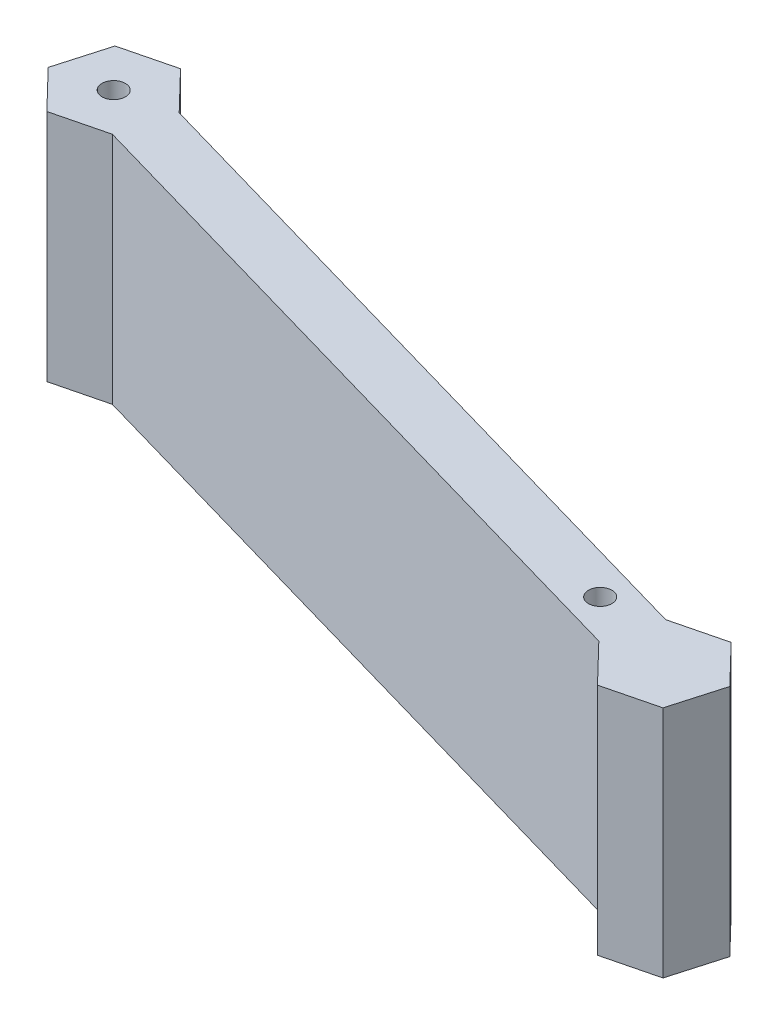
ISO-10303-21;
HEADER;
FILE_DESCRIPTION(('STEP AP214'),'2;1');
FILE_NAME('part.step','',(''),(''),'','','');
FILE_SCHEMA(('AUTOMOTIVE_DESIGN { 1 0 10303 214 1 1 1 1 }'));
ENDSEC;
DATA;
#1=APPLICATION_CONTEXT('core data for automotive mechanical design processes');
#2=APPLICATION_PROTOCOL_DEFINITION('international standard','automotive_design',2000,#1);
#3=PRODUCT_CONTEXT('',#1,'mechanical');
#4=PRODUCT('Part','Part','',(#3));
#5=PRODUCT_RELATED_PRODUCT_CATEGORY('part','',(#4));
#6=PRODUCT_DEFINITION_FORMATION('','',#4);
#7=PRODUCT_DEFINITION_CONTEXT('part definition',#1,'design');
#8=PRODUCT_DEFINITION('design','',#6,#7);
#9=PRODUCT_DEFINITION_SHAPE('','',#8);
#10=(LENGTH_UNIT() NAMED_UNIT(*) SI_UNIT(.MILLI.,.METRE.));
#11=(NAMED_UNIT(*) PLANE_ANGLE_UNIT() SI_UNIT($,.RADIAN.));
#12=(NAMED_UNIT(*) SI_UNIT($,.STERADIAN.) SOLID_ANGLE_UNIT());
#13=UNCERTAINTY_MEASURE_WITH_UNIT(LENGTH_MEASURE(1.E-05),#10,'distance_accuracy_value','');
#14=(GEOMETRIC_REPRESENTATION_CONTEXT(3) GLOBAL_UNCERTAINTY_ASSIGNED_CONTEXT((#13)) GLOBAL_UNIT_ASSIGNED_CONTEXT((#10,
#11,#12)) REPRESENTATION_CONTEXT('',''));
#15=CARTESIAN_POINT('',(0.,0.,0.));
#16=DIRECTION('',(0.,0.,1.));
#17=DIRECTION('',(1.,0.,0.));
#18=AXIS2_PLACEMENT_3D('',#15,#16,#17);
#19=CARTESIAN_POINT('',(-1.91026278693189,30.,6.65964684385465));
#20=DIRECTION('',(-0.241835763884429,0.,-0.970317197264088));
#21=DIRECTION('',(-0.970317197264088,0.,0.241835763884429));
#22=AXIS2_PLACEMENT_3D('',#19,#20,#21);
#23=PLANE('',#22);
#24=DIRECTION('',(0.970317197264088,0.,-0.241835763884429));
#25=VECTOR('',#24,1.);
#26=CARTESIAN_POINT('',(-1.91026278693189,0.,6.65964684385465));
#27=LINE('',#26,#25);
#28=CARTESIAN_POINT('',(-1.91026278693189,0.,6.65964684385465));
#29=VERTEX_POINT('',#28);
#30=CARTESIAN_POINT('',(4.81229195354504,0.,4.9841595233144));
#31=VERTEX_POINT('',#30);
#32=EDGE_CURVE('E120',#29,#31,#27,.T.);
#33=ORIENTED_EDGE('',*,*,#32,.T.);
#34=DIRECTION('',(0.,-1.,0.));
#35=VECTOR('',#34,1.);
#36=CARTESIAN_POINT('',(4.81229195354504,30.,4.9841595233144));
#37=LINE('',#36,#35);
#38=CARTESIAN_POINT('',(4.81229195354504,30.,4.9841595233144));
#39=VERTEX_POINT('',#38);
#40=EDGE_CURVE('E11',#39,#31,#37,.T.);
#41=ORIENTED_EDGE('',*,*,#40,.F.);
#42=DIRECTION('',(0.970317197264088,0.,-0.241835763884429));
#43=VECTOR('',#42,1.);
#44=CARTESIAN_POINT('',(-1.91026278693189,30.,6.65964684385465));
#45=LINE('',#44,#43);
#46=CARTESIAN_POINT('',(-1.91026278693189,30.,6.65964684385465));
#47=VERTEX_POINT('',#46);
#48=EDGE_CURVE('E84',#47,#39,#45,.T.);
#49=ORIENTED_EDGE('',*,*,#48,.F.);
#50=DIRECTION('',(0.,-1.,0.));
#51=VECTOR('',#50,1.);
#52=CARTESIAN_POINT('',(-1.91026278693189,30.,6.65964684385465));
#53=LINE('',#52,#51);
#54=EDGE_CURVE('E116',#47,#29,#53,.T.);
#55=ORIENTED_EDGE('',*,*,#54,.T.);
#56=EDGE_LOOP('',(#33,#41,#49,#55));
#57=FACE_BOUND('',#56,.T.);
#58=ADVANCED_FACE('F35',(#57),#23,.F.);
#59=CARTESIAN_POINT('',(6.72255474047693,30.,-1.67548732054025));
#60=DIRECTION('',(-0.719401460617402,0.,0.694594513699575));
#61=DIRECTION('',(0.694594513699575,0.,0.719401460617402));
#62=AXIS2_PLACEMENT_3D('',#59,#60,#61);
#63=PLANE('',#62);
#64=DIRECTION('',(-0.694594513699575,0.,-0.719401460617402));
#65=VECTOR('',#64,1.);
#66=CARTESIAN_POINT('',(6.72255474047693,0.,-1.67548732054025));
#67=LINE('',#66,#65);
#68=CARTESIAN_POINT('',(6.72255474047693,0.,-1.67548732054025));
#69=VERTEX_POINT('',#68);
#70=CARTESIAN_POINT('',(1.91026278693189,0.,-6.65964684385465));
#71=VERTEX_POINT('',#70);
#72=EDGE_CURVE('E123',#69,#71,#67,.T.);
#73=ORIENTED_EDGE('',*,*,#72,.T.);
#74=DIRECTION('',(0.,-1.,0.));
#75=VECTOR('',#74,1.);
#76=CARTESIAN_POINT('',(1.91026278693189,30.,-6.65964684385465));
#77=LINE('',#76,#75);
#78=CARTESIAN_POINT('',(1.91026278693189,30.,-6.65964684385465));
#79=VERTEX_POINT('',#78);
#80=EDGE_CURVE('E111',#79,#71,#77,.T.);
#81=ORIENTED_EDGE('',*,*,#80,.F.);
#82=DIRECTION('',(-0.694594513699575,0.,-0.719401460617402));
#83=VECTOR('',#82,1.);
#84=CARTESIAN_POINT('',(6.72255474047693,30.,-1.67548732054025));
#85=LINE('',#84,#83);
#86=CARTESIAN_POINT('',(6.72255474047693,30.,-1.67548732054025));
#87=VERTEX_POINT('',#86);
#88=EDGE_CURVE('E102',#87,#79,#85,.T.);
#89=ORIENTED_EDGE('',*,*,#88,.F.);
#90=DIRECTION('',(0.,-1.,0.));
#91=VECTOR('',#90,1.);
#92=CARTESIAN_POINT('',(6.72255474047693,30.,-1.67548732054025));
#93=LINE('',#92,#91);
#94=EDGE_CURVE('E43',#87,#69,#93,.T.);
#95=ORIENTED_EDGE('',*,*,#94,.T.);
#96=EDGE_LOOP('',(#73,#81,#89,#95));
#97=FACE_BOUND('',#96,.T.);
#98=ADVANCED_FACE('F134',(#97),#63,.F.);
#99=CARTESIAN_POINT('',(1.91026278693189,30.,-6.65964684385465));
#100=DIRECTION('',(0.241835763884429,0.,0.970317197264088));
#101=DIRECTION('',(0.970317197264088,0.,-0.241835763884429));
#102=AXIS2_PLACEMENT_3D('',#99,#100,#101);
#103=PLANE('',#102);
#104=DIRECTION('',(-0.970317197264088,0.,0.241835763884429));
#105=VECTOR('',#104,1.);
#106=CARTESIAN_POINT('',(1.91026278693189,0.,-6.65964684385465));
#107=LINE('',#106,#105);
#108=CARTESIAN_POINT('',(-4.81229195354504,0.,-4.9841595233144));
#109=VERTEX_POINT('',#108);
#110=EDGE_CURVE('E110',#71,#109,#107,.T.);
#111=ORIENTED_EDGE('',*,*,#110,.T.);
#112=DIRECTION('',(0.,-1.,0.));
#113=VECTOR('',#112,1.);
#114=CARTESIAN_POINT('',(-4.81229195354504,30.,-4.9841595233144));
#115=LINE('',#114,#113);
#116=CARTESIAN_POINT('',(-4.81229195354504,30.,-4.9841595233144));
#117=VERTEX_POINT('',#116);
#118=EDGE_CURVE('E107',#117,#109,#115,.T.);
#119=ORIENTED_EDGE('',*,*,#118,.F.);
#120=DIRECTION('',(-0.970317197264088,0.,0.241835763884429));
#121=VECTOR('',#120,1.);
#122=CARTESIAN_POINT('',(1.91026278693189,30.,-6.65964684385465));
#123=LINE('',#122,#121);
#124=EDGE_CURVE('E96',#79,#117,#123,.T.);
#125=ORIENTED_EDGE('',*,*,#124,.F.);
#126=ORIENTED_EDGE('',*,*,#80,.T.);
#127=EDGE_LOOP('',(#111,#119,#125,#126));
#128=FACE_BOUND('',#127,.T.);
#129=ADVANCED_FACE('F108',(#128),#103,.F.);
#130=CARTESIAN_POINT('',(-4.81229195354504,30.,-4.9841595233144));
#131=DIRECTION('',(0.961237224501831,0.,0.275722683564513));
#132=DIRECTION('',(0.275722683564513,0.,-0.961237224501831));
#133=AXIS2_PLACEMENT_3D('',#130,#131,#132);
#134=PLANE('',#133);
#135=DIRECTION('',(-0.275722683564513,0.,0.961237224501831));
#136=VECTOR('',#135,1.);
#137=CARTESIAN_POINT('',(-4.81229195354504,0.,-4.9841595233144));
#138=LINE('',#137,#136);
#139=CARTESIAN_POINT('',(-6.72255474047693,0.,1.67548732054025));
#140=VERTEX_POINT('',#139);
#141=EDGE_CURVE('E72',#109,#140,#138,.T.);
#142=ORIENTED_EDGE('',*,*,#141,.T.);
#143=DIRECTION('',(0.,-1.,0.));
#144=VECTOR('',#143,1.);
#145=CARTESIAN_POINT('',(-6.72255474047693,30.,1.67548732054025));
#146=LINE('',#145,#144);
#147=CARTESIAN_POINT('',(-6.72255474047693,30.,1.67548732054025));
#148=VERTEX_POINT('',#147);
#149=EDGE_CURVE('E112',#148,#140,#146,.T.);
#150=ORIENTED_EDGE('',*,*,#149,.F.);
#151=DIRECTION('',(-0.275722683564513,0.,0.961237224501831));
#152=VECTOR('',#151,1.);
#153=CARTESIAN_POINT('',(-4.81229195354504,30.,-4.9841595233144));
#154=LINE('',#153,#152);
#155=EDGE_CURVE('E100',#117,#148,#154,.T.);
#156=ORIENTED_EDGE('',*,*,#155,.F.);
#157=ORIENTED_EDGE('',*,*,#118,.T.);
#158=EDGE_LOOP('',(#142,#150,#156,#157));
#159=FACE_BOUND('',#158,.T.);
#160=ADVANCED_FACE('F114',(#159),#134,.F.);
#161=CARTESIAN_POINT('',(-6.72255474047693,30.,1.67548732054025));
#162=DIRECTION('',(0.719401460617402,0.,-0.694594513699575));
#163=DIRECTION('',(-0.694594513699575,0.,-0.719401460617402));
#164=AXIS2_PLACEMENT_3D('',#161,#162,#163);
#165=PLANE('',#164);
#166=DIRECTION('',(0.694594513699575,0.,0.719401460617402));
#167=VECTOR('',#166,1.);
#168=CARTESIAN_POINT('',(-6.72255474047693,0.,1.67548732054025));
#169=LINE('',#168,#167);
#170=EDGE_CURVE('E78',#140,#29,#169,.T.);
#171=ORIENTED_EDGE('',*,*,#170,.T.);
#172=ORIENTED_EDGE('',*,*,#54,.F.);
#173=DIRECTION('',(0.694594513699575,0.,0.719401460617402));
#174=VECTOR('',#173,1.);
#175=CARTESIAN_POINT('',(-6.72255474047693,30.,1.67548732054025));
#176=LINE('',#175,#174);
#177=EDGE_CURVE('E51',#148,#47,#176,.T.);
#178=ORIENTED_EDGE('',*,*,#177,.F.);
#179=ORIENTED_EDGE('',*,*,#149,.T.);
#180=EDGE_LOOP('',(#171,#172,#178,#179));
#181=FACE_BOUND('',#180,.T.);
#182=ADVANCED_FACE('F183',(#181),#165,.F.);
#183=CARTESIAN_POINT('',(0.,30.,0.));
#184=DIRECTION('',(0.,1.,0.));
#185=DIRECTION('',(0.,0.,1.));
#186=AXIS2_PLACEMENT_3D('',#183,#184,#185);
#187=PLANE('',#186);
#188=CARTESIAN_POINT('',(87.4725874296667,30.,25.0907642043707));
#189=DIRECTION('',(0.,1.,0.));
#190=DIRECTION('',(0.530069814163499,0.,-0.847954003535967));
#191=AXIS2_PLACEMENT_3D('',#188,#189,#190);
#192=CIRCLE('',#191,1.5);
#193=CARTESIAN_POINT('',(88.2676921509119,30.,23.8188331990668));
#194=VERTEX_POINT('',#193);
#195=EDGE_CURVE('E274',#194,#194,#192,.T.);
#196=ORIENTED_EDGE('',*,*,#195,.F.);
#197=EDGE_LOOP('',(#196));
#198=FACE_BOUND('',#197,.T.);
#199=CARTESIAN_POINT('',(0.,30.,0.));
#200=DIRECTION('',(0.,-1.,0.));
#201=DIRECTION('',(0.,0.,-1.));
#202=AXIS2_PLACEMENT_3D('',#199,#200,#201);
#203=CIRCLE('',#202,1.5);
#204=CARTESIAN_POINT('',(0.,30.,-1.5));
#205=VERTEX_POINT('',#204);
#206=EDGE_CURVE('E124',#205,#205,#203,.T.);
#207=ORIENTED_EDGE('',*,*,#206,.T.);
#208=EDGE_LOOP('',(#207));
#209=FACE_BOUND('',#208,.T.);
#210=ORIENTED_EDGE('',*,*,#48,.T.);
#211=DIRECTION('',(-0.961237224501831,0.,-0.275722683564513));
#212=VECTOR('',#211,1.);
#213=CARTESIAN_POINT('',(92.2848793832117,30.,30.0749237276851));
#214=LINE('',#213,#212);
#215=CARTESIAN_POINT('',(92.2848793832117,30.,30.0749237276851));
#216=VERTEX_POINT('',#215);
#217=EDGE_CURVE('E154',#216,#39,#214,.T.);
#218=ORIENTED_EDGE('',*,*,#217,.F.);
#219=DIRECTION('',(0.694594513699575,0.,0.719401460617401));
#220=VECTOR('',#219,1.);
#221=CARTESIAN_POINT('',(92.2848793832117,30.,30.0749237276851));
#222=LINE('',#221,#220);
#223=CARTESIAN_POINT('',(97.0971713367567,30.,35.0590832509995));
#224=VERTEX_POINT('',#223);
#225=EDGE_CURVE('E281',#216,#224,#222,.T.);
#226=ORIENTED_EDGE('',*,*,#225,.T.);
#227=DIRECTION('',(0.970317197264088,0.,-0.241835763884429));
#228=VECTOR('',#227,1.);
#229=CARTESIAN_POINT('',(97.0971713367567,30.,35.0590832509995));
#230=LINE('',#229,#228);
#231=CARTESIAN_POINT('',(103.819726077234,30.,33.3835959304592));
#232=VERTEX_POINT('',#231);
#233=EDGE_CURVE('E224',#224,#232,#230,.T.);
#234=ORIENTED_EDGE('',*,*,#233,.T.);
#235=DIRECTION('',(0.275722683564513,0.,-0.961237224501831));
#236=VECTOR('',#235,1.);
#237=CARTESIAN_POINT('',(103.819726077234,30.,33.3835959304592));
#238=LINE('',#237,#236);
#239=CARTESIAN_POINT('',(105.729988864166,30.,26.7239490866046));
#240=VERTEX_POINT('',#239);
#241=EDGE_CURVE('E214',#232,#240,#238,.T.);
#242=ORIENTED_EDGE('',*,*,#241,.T.);
#243=DIRECTION('',(-0.694594513699575,0.,-0.719401460617402));
#244=VECTOR('',#243,1.);
#245=CARTESIAN_POINT('',(105.729988864166,30.,26.7239490866046));
#246=LINE('',#245,#244);
#247=CARTESIAN_POINT('',(100.91769691062,30.,21.7397895632902));
#248=VERTEX_POINT('',#247);
#249=EDGE_CURVE('E261',#240,#248,#246,.T.);
#250=ORIENTED_EDGE('',*,*,#249,.T.);
#251=DIRECTION('',(-0.970317197264088,0.,0.24183576388443));
#252=VECTOR('',#251,1.);
#253=CARTESIAN_POINT('',(100.91769691062,30.,21.7397895632902));
#254=LINE('',#253,#252);
#255=CARTESIAN_POINT('',(94.1951421701436,30.,23.4152768838304));
#256=VERTEX_POINT('',#255);
#257=EDGE_CURVE('E236',#248,#256,#254,.T.);
#258=ORIENTED_EDGE('',*,*,#257,.T.);
#259=DIRECTION('',(-0.961237224501831,0.,-0.275722683564513));
#260=VECTOR('',#259,1.);
#261=CARTESIAN_POINT('',(94.1951421701436,30.,23.4152768838304));
#262=LINE('',#261,#260);
#263=EDGE_CURVE('E162',#256,#87,#262,.T.);
#264=ORIENTED_EDGE('',*,*,#263,.T.);
#265=ORIENTED_EDGE('',*,*,#88,.T.);
#266=ORIENTED_EDGE('',*,*,#124,.T.);
#267=ORIENTED_EDGE('',*,*,#155,.T.);
#268=ORIENTED_EDGE('',*,*,#177,.T.);
#269=EDGE_LOOP('',(#210,#218,#226,#234,#242,#250,#258,#264,#265,#266,#267,#268));
#270=FACE_BOUND('',#269,.T.);
#271=ADVANCED_FACE('F98',(#198,#209,#270),#187,.T.);
#272=CARTESIAN_POINT('',(0.,0.,0.));
#273=DIRECTION('',(0.,1.,0.));
#274=DIRECTION('',(0.,0.,1.));
#275=AXIS2_PLACEMENT_3D('',#272,#273,#274);
#276=PLANE('',#275);
#277=CARTESIAN_POINT('',(87.4725874296667,0.,25.0907642043707));
#278=DIRECTION('',(0.,1.,0.));
#279=DIRECTION('',(0.530069814163499,0.,-0.847954003535967));
#280=AXIS2_PLACEMENT_3D('',#277,#278,#279);
#281=CIRCLE('',#280,1.5);
#282=CARTESIAN_POINT('',(88.2676921509119,0.,23.8188331990668));
#283=VERTEX_POINT('',#282);
#284=EDGE_CURVE('E277',#283,#283,#281,.T.);
#285=ORIENTED_EDGE('',*,*,#284,.T.);
#286=EDGE_LOOP('',(#285));
#287=FACE_BOUND('',#286,.T.);
#288=CARTESIAN_POINT('',(0.,0.,0.));
#289=DIRECTION('',(0.,-1.,0.));
#290=DIRECTION('',(0.,0.,-1.));
#291=AXIS2_PLACEMENT_3D('',#288,#289,#290);
#292=CIRCLE('',#291,1.5);
#293=CARTESIAN_POINT('',(0.,0.,-1.5));
#294=VERTEX_POINT('',#293);
#295=EDGE_CURVE('E164',#294,#294,#292,.T.);
#296=ORIENTED_EDGE('',*,*,#295,.F.);
#297=EDGE_LOOP('',(#296));
#298=FACE_BOUND('',#297,.T.);
#299=ORIENTED_EDGE('',*,*,#32,.F.);
#300=ORIENTED_EDGE('',*,*,#170,.F.);
#301=ORIENTED_EDGE('',*,*,#141,.F.);
#302=ORIENTED_EDGE('',*,*,#110,.F.);
#303=ORIENTED_EDGE('',*,*,#72,.F.);
#304=DIRECTION('',(-0.961237224501831,0.,-0.275722683564513));
#305=VECTOR('',#304,1.);
#306=CARTESIAN_POINT('',(94.1951421701436,0.,23.4152768838304));
#307=LINE('',#306,#305);
#308=CARTESIAN_POINT('',(94.1951421701436,0.,23.4152768838304));
#309=VERTEX_POINT('',#308);
#310=EDGE_CURVE('E144',#309,#69,#307,.T.);
#311=ORIENTED_EDGE('',*,*,#310,.F.);
#312=DIRECTION('',(-0.970317197264088,0.,0.24183576388443));
#313=VECTOR('',#312,1.);
#314=CARTESIAN_POINT('',(100.91769691062,0.,21.7397895632902));
#315=LINE('',#314,#313);
#316=CARTESIAN_POINT('',(100.91769691062,0.,21.7397895632902));
#317=VERTEX_POINT('',#316);
#318=EDGE_CURVE('E212',#317,#309,#315,.T.);
#319=ORIENTED_EDGE('',*,*,#318,.F.);
#320=DIRECTION('',(-0.694594513699575,0.,-0.719401460617402));
#321=VECTOR('',#320,1.);
#322=CARTESIAN_POINT('',(105.729988864166,0.,26.7239490866046));
#323=LINE('',#322,#321);
#324=CARTESIAN_POINT('',(105.729988864166,0.,26.7239490866046));
#325=VERTEX_POINT('',#324);
#326=EDGE_CURVE('E216',#325,#317,#323,.T.);
#327=ORIENTED_EDGE('',*,*,#326,.F.);
#328=DIRECTION('',(0.275722683564513,0.,-0.961237224501831));
#329=VECTOR('',#328,1.);
#330=CARTESIAN_POINT('',(103.819726077234,0.,33.3835959304592));
#331=LINE('',#330,#329);
#332=CARTESIAN_POINT('',(103.819726077234,0.,33.3835959304592));
#333=VERTEX_POINT('',#332);
#334=EDGE_CURVE('E273',#333,#325,#331,.T.);
#335=ORIENTED_EDGE('',*,*,#334,.F.);
#336=DIRECTION('',(0.970317197264088,0.,-0.241835763884429));
#337=VECTOR('',#336,1.);
#338=CARTESIAN_POINT('',(97.0971713367567,0.,35.0590832509995));
#339=LINE('',#338,#337);
#340=CARTESIAN_POINT('',(97.0971713367567,0.,35.0590832509995));
#341=VERTEX_POINT('',#340);
#342=EDGE_CURVE('E207',#341,#333,#339,.T.);
#343=ORIENTED_EDGE('',*,*,#342,.F.);
#344=DIRECTION('',(0.694594513699575,0.,0.719401460617401));
#345=VECTOR('',#344,1.);
#346=CARTESIAN_POINT('',(92.2848793832117,0.,30.0749237276851));
#347=LINE('',#346,#345);
#348=CARTESIAN_POINT('',(92.2848793832117,0.,30.0749237276851));
#349=VERTEX_POINT('',#348);
#350=EDGE_CURVE('E203',#349,#341,#347,.T.);
#351=ORIENTED_EDGE('',*,*,#350,.F.);
#352=DIRECTION('',(-0.961237224501831,0.,-0.275722683564513));
#353=VECTOR('',#352,1.);
#354=CARTESIAN_POINT('',(92.2848793832117,0.,30.0749237276851));
#355=LINE('',#354,#353);
#356=EDGE_CURVE('E150',#349,#31,#355,.T.);
#357=ORIENTED_EDGE('',*,*,#356,.T.);
#358=EDGE_LOOP('',(#299,#300,#301,#302,#303,#311,#319,#327,#335,#343,#351,#357));
#359=FACE_BOUND('',#358,.T.);
#360=ADVANCED_FACE('F141',(#287,#298,#359),#276,.F.);
#361=CARTESIAN_POINT('',(0.,30.,0.));
#362=DIRECTION('',(0.,-1.,0.));
#363=DIRECTION('',(0.,0.,-1.));
#364=AXIS2_PLACEMENT_3D('',#361,#362,#363);
#365=CYLINDRICAL_SURFACE('',#364,1.5);
#366=ORIENTED_EDGE('',*,*,#206,.F.);
#367=EDGE_LOOP('',(#366));
#368=FACE_BOUND('',#367,.T.);
#369=ORIENTED_EDGE('',*,*,#295,.T.);
#370=EDGE_LOOP('',(#369));
#371=FACE_BOUND('',#370,.T.);
#372=ADVANCED_FACE('F171',(#368,#371),#365,.F.);
#373=CARTESIAN_POINT('',(94.1951421701436,0.,23.4152768838304));
#374=DIRECTION('',(-0.275722683564513,0.,0.961237224501831));
#375=DIRECTION('',(0.961237224501831,0.,0.275722683564513));
#376=AXIS2_PLACEMENT_3D('',#373,#374,#375);
#377=PLANE('',#376);
#378=ORIENTED_EDGE('',*,*,#94,.F.);
#379=ORIENTED_EDGE('',*,*,#263,.F.);
#380=DIRECTION('',(0.,1.,0.));
#381=VECTOR('',#380,1.);
#382=CARTESIAN_POINT('',(94.1951421701436,0.,23.4152768838304));
#383=LINE('',#382,#381);
#384=EDGE_CURVE('E149',#309,#256,#383,.T.);
#385=ORIENTED_EDGE('',*,*,#384,.F.);
#386=ORIENTED_EDGE('',*,*,#310,.T.);
#387=EDGE_LOOP('',(#378,#379,#385,#386));
#388=FACE_BOUND('',#387,.T.);
#389=ADVANCED_FACE('F147',(#388),#377,.F.);
#390=CARTESIAN_POINT('',(92.2848793832117,0.,30.0749237276851));
#391=DIRECTION('',(0.275722683564513,0.,-0.961237224501831));
#392=DIRECTION('',(-0.961237224501831,0.,-0.275722683564513));
#393=AXIS2_PLACEMENT_3D('',#390,#391,#392);
#394=PLANE('',#393);
#395=ORIENTED_EDGE('',*,*,#40,.T.);
#396=ORIENTED_EDGE('',*,*,#356,.F.);
#397=DIRECTION('',(0.,-1.,0.));
#398=VECTOR('',#397,1.);
#399=CARTESIAN_POINT('',(92.2848793832117,0.,30.0749237276851));
#400=LINE('',#399,#398);
#401=EDGE_CURVE('E151',#216,#349,#400,.T.);
#402=ORIENTED_EDGE('',*,*,#401,.F.);
#403=ORIENTED_EDGE('',*,*,#217,.T.);
#404=EDGE_LOOP('',(#395,#396,#402,#403));
#405=FACE_BOUND('',#404,.T.);
#406=ADVANCED_FACE('F198',(#405),#394,.F.);
#407=CARTESIAN_POINT('',(103.819726077234,30.,33.3835959304592));
#408=DIRECTION('',(-0.961237224501831,0.,-0.275722683564513));
#409=DIRECTION('',(-0.275722683564513,0.,0.961237224501831));
#410=AXIS2_PLACEMENT_3D('',#407,#408,#409);
#411=PLANE('',#410);
#412=ORIENTED_EDGE('',*,*,#334,.T.);
#413=DIRECTION('',(0.,-1.,0.));
#414=VECTOR('',#413,1.);
#415=CARTESIAN_POINT('',(105.729988864166,30.,26.7239490866046));
#416=LINE('',#415,#414);
#417=EDGE_CURVE('E229',#240,#325,#416,.T.);
#418=ORIENTED_EDGE('',*,*,#417,.F.);
#419=ORIENTED_EDGE('',*,*,#241,.F.);
#420=DIRECTION('',(0.,-1.,0.));
#421=VECTOR('',#420,1.);
#422=CARTESIAN_POINT('',(103.819726077234,30.,33.3835959304592));
#423=LINE('',#422,#421);
#424=EDGE_CURVE('E220',#232,#333,#423,.T.);
#425=ORIENTED_EDGE('',*,*,#424,.T.);
#426=EDGE_LOOP('',(#412,#418,#419,#425));
#427=FACE_BOUND('',#426,.T.);
#428=ADVANCED_FACE('F272',(#427),#411,.F.);
#429=CARTESIAN_POINT('',(105.729988864166,30.,26.7239490866046));
#430=DIRECTION('',(-0.719401460617402,0.,0.694594513699575));
#431=DIRECTION('',(0.694594513699575,0.,0.719401460617402));
#432=AXIS2_PLACEMENT_3D('',#429,#430,#431);
#433=PLANE('',#432);
#434=ORIENTED_EDGE('',*,*,#326,.T.);
#435=DIRECTION('',(0.,-1.,0.));
#436=VECTOR('',#435,1.);
#437=CARTESIAN_POINT('',(100.91769691062,30.,21.7397895632902));
#438=LINE('',#437,#436);
#439=EDGE_CURVE('E226',#248,#317,#438,.T.);
#440=ORIENTED_EDGE('',*,*,#439,.F.);
#441=ORIENTED_EDGE('',*,*,#249,.F.);
#442=ORIENTED_EDGE('',*,*,#417,.T.);
#443=EDGE_LOOP('',(#434,#440,#441,#442));
#444=FACE_BOUND('',#443,.T.);
#445=ADVANCED_FACE('F263',(#444),#433,.F.);
#446=CARTESIAN_POINT('',(100.91769691062,30.,21.7397895632902));
#447=DIRECTION('',(0.24183576388443,0.,0.970317197264087));
#448=DIRECTION('',(0.970317197264088,0.,-0.24183576388443));
#449=AXIS2_PLACEMENT_3D('',#446,#447,#448);
#450=PLANE('',#449);
#451=ORIENTED_EDGE('',*,*,#318,.T.);
#452=ORIENTED_EDGE('',*,*,#384,.T.);
#453=ORIENTED_EDGE('',*,*,#257,.F.);
#454=ORIENTED_EDGE('',*,*,#439,.T.);
#455=EDGE_LOOP('',(#451,#452,#453,#454));
#456=FACE_BOUND('',#455,.T.);
#457=ADVANCED_FACE('F233',(#456),#450,.F.);
#458=CARTESIAN_POINT('',(92.2848793832117,30.,30.0749237276851));
#459=DIRECTION('',(0.719401460617401,0.,-0.694594513699575));
#460=DIRECTION('',(-0.694594513699575,0.,-0.719401460617401));
#461=AXIS2_PLACEMENT_3D('',#458,#459,#460);
#462=PLANE('',#461);
#463=ORIENTED_EDGE('',*,*,#350,.T.);
#464=DIRECTION('',(0.,-1.,0.));
#465=VECTOR('',#464,1.);
#466=CARTESIAN_POINT('',(97.0971713367567,30.,35.0590832509995));
#467=LINE('',#466,#465);
#468=EDGE_CURVE('E223',#224,#341,#467,.T.);
#469=ORIENTED_EDGE('',*,*,#468,.F.);
#470=ORIENTED_EDGE('',*,*,#225,.F.);
#471=ORIENTED_EDGE('',*,*,#401,.T.);
#472=EDGE_LOOP('',(#463,#469,#470,#471));
#473=FACE_BOUND('',#472,.T.);
#474=ADVANCED_FACE('F294',(#473),#462,.F.);
#475=CARTESIAN_POINT('',(97.0971713367567,30.,35.0590832509995));
#476=DIRECTION('',(-0.241835763884429,0.,-0.970317197264088));
#477=DIRECTION('',(-0.970317197264088,0.,0.241835763884429));
#478=AXIS2_PLACEMENT_3D('',#475,#476,#477);
#479=PLANE('',#478);
#480=ORIENTED_EDGE('',*,*,#342,.T.);
#481=ORIENTED_EDGE('',*,*,#424,.F.);
#482=ORIENTED_EDGE('',*,*,#233,.F.);
#483=ORIENTED_EDGE('',*,*,#468,.T.);
#484=EDGE_LOOP('',(#480,#481,#482,#483));
#485=FACE_BOUND('',#484,.T.);
#486=ADVANCED_FACE('F288',(#485),#479,.F.);
#487=CARTESIAN_POINT('',(87.4725874296667,30.,25.0907642043707));
#488=DIRECTION('',(0.,-1.,0.));
#489=DIRECTION('',(0.,0.,-1.));
#490=AXIS2_PLACEMENT_3D('',#487,#488,#489);
#491=CYLINDRICAL_SURFACE('',#490,1.5);
#492=ORIENTED_EDGE('',*,*,#195,.T.);
#493=EDGE_LOOP('',(#492));
#494=FACE_BOUND('',#493,.T.);
#495=ORIENTED_EDGE('',*,*,#284,.F.);
#496=EDGE_LOOP('',(#495));
#497=FACE_BOUND('',#496,.T.);
#498=ADVANCED_FACE('F286',(#494,#497),#491,.F.);
#499=CLOSED_SHELL('',(#58,#98,#129,#160,#182,#271,#360,#372,#389,#406,#428,#445,#457,#474,#486,#498));
#500=MANIFOLD_SOLID_BREP('B2',#499);
#501=ADVANCED_BREP_SHAPE_REPRESENTATION('',(#18,#500),#14);
#502=SHAPE_DEFINITION_REPRESENTATION(#9,#501);
ENDSEC;
END-ISO-10303-21;
